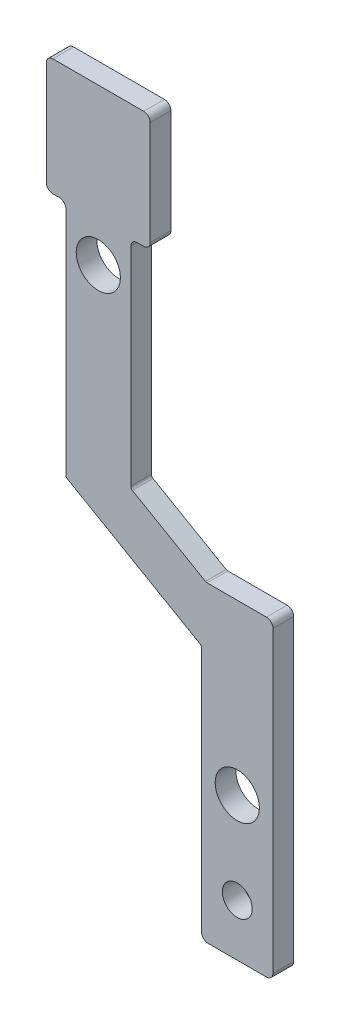
ISO-10303-21;
HEADER;
FILE_DESCRIPTION(('STEP AP214'),'2;1');
FILE_NAME('part.step','',(''),(''),'','','');
FILE_SCHEMA(('AUTOMOTIVE_DESIGN { 1 0 10303 214 1 1 1 1 }'));
ENDSEC;
DATA;
#1=APPLICATION_CONTEXT('core data for automotive mechanical design processes');
#2=APPLICATION_PROTOCOL_DEFINITION('international standard','automotive_design',2000,#1);
#3=PRODUCT_CONTEXT('',#1,'mechanical');
#4=PRODUCT('Part','Part','',(#3));
#5=PRODUCT_RELATED_PRODUCT_CATEGORY('part','',(#4));
#6=PRODUCT_DEFINITION_FORMATION('','',#4);
#7=PRODUCT_DEFINITION_CONTEXT('part definition',#1,'design');
#8=PRODUCT_DEFINITION('design','',#6,#7);
#9=PRODUCT_DEFINITION_SHAPE('','',#8);
#10=(LENGTH_UNIT() NAMED_UNIT(*) SI_UNIT(.MILLI.,.METRE.));
#11=(NAMED_UNIT(*) PLANE_ANGLE_UNIT() SI_UNIT($,.RADIAN.));
#12=(NAMED_UNIT(*) SI_UNIT($,.STERADIAN.) SOLID_ANGLE_UNIT());
#13=UNCERTAINTY_MEASURE_WITH_UNIT(LENGTH_MEASURE(1.E-05),#10,'distance_accuracy_value','');
#14=(GEOMETRIC_REPRESENTATION_CONTEXT(3) GLOBAL_UNCERTAINTY_ASSIGNED_CONTEXT((#13)) GLOBAL_UNIT_ASSIGNED_CONTEXT((#10,
#11,#12)) REPRESENTATION_CONTEXT('',''));
#15=CARTESIAN_POINT('',(0.,0.,0.));
#16=DIRECTION('',(0.,0.,1.));
#17=DIRECTION('',(1.,0.,0.));
#18=AXIS2_PLACEMENT_3D('',#15,#16,#17);
#19=CARTESIAN_POINT('',(8.00626999999999,44.50635,1.59144));
#20=DIRECTION('',(0.,0.,-1.));
#21=DIRECTION('',(-1.,0.,0.));
#22=AXIS2_PLACEMENT_3D('',#19,#20,#21);
#23=CYLINDRICAL_SURFACE('',#22,0.499999999999994);
#24=CARTESIAN_POINT('',(8.00626999999999,44.50635,0.));
#25=DIRECTION('',(0.,0.,1.));
#26=DIRECTION('',(-1.,0.,0.));
#27=AXIS2_PLACEMENT_3D('',#24,#25,#26);
#28=CIRCLE('',#27,0.499999999999994);
#29=CARTESIAN_POINT('',(8.00626999999999,44.00635,0.));
#30=VERTEX_POINT('',#29);
#31=CARTESIAN_POINT('',(8.50626999999998,44.50635,0.));
#32=VERTEX_POINT('',#31);
#33=EDGE_CURVE('E243',#30,#32,#28,.T.);
#34=ORIENTED_EDGE('',*,*,#33,.T.);
#35=DIRECTION('',(0.,0.,-1.));
#36=VECTOR('',#35,1.);
#37=CARTESIAN_POINT('',(8.50626999999998,44.50635,1.59144));
#38=LINE('',#37,#36);
#39=CARTESIAN_POINT('',(8.50626999999998,44.50635,1.59144));
#40=VERTEX_POINT('',#39);
#41=EDGE_CURVE('E11',#40,#32,#38,.T.);
#42=ORIENTED_EDGE('',*,*,#41,.F.);
#43=CARTESIAN_POINT('',(8.00626999999999,44.50635,1.59144));
#44=DIRECTION('',(0.,0.,1.));
#45=DIRECTION('',(-1.,0.,0.));
#46=AXIS2_PLACEMENT_3D('',#43,#44,#45);
#47=CIRCLE('',#46,0.499999999999994);
#48=CARTESIAN_POINT('',(8.00626999999999,44.00635,1.59144));
#49=VERTEX_POINT('',#48);
#50=EDGE_CURVE('E294',#49,#40,#47,.T.);
#51=ORIENTED_EDGE('',*,*,#50,.F.);
#52=DIRECTION('',(0.,0.,-1.));
#53=VECTOR('',#52,1.);
#54=CARTESIAN_POINT('',(8.00626999999999,44.00635,1.59144));
#55=LINE('',#54,#53);
#56=EDGE_CURVE('E239',#49,#30,#55,.T.);
#57=ORIENTED_EDGE('',*,*,#56,.T.);
#58=EDGE_LOOP('',(#34,#42,#51,#57));
#59=FACE_BOUND('',#58,.T.);
#60=ADVANCED_FACE('F39',(#59),#23,.T.);
#61=CARTESIAN_POINT('',(8.50626999999997,52.50635,1.59144));
#62=DIRECTION('',(-1.,0.,0.));
#63=DIRECTION('',(0.,-1.,0.));
#64=AXIS2_PLACEMENT_3D('',#61,#62,#63);
#65=PLANE('',#64);
#66=DIRECTION('',(0.,1.,0.));
#67=VECTOR('',#66,1.);
#68=CARTESIAN_POINT('',(8.50626999999997,52.50635,0.));
#69=LINE('',#68,#67);
#70=CARTESIAN_POINT('',(8.50626999999997,52.50635,0.));
#71=VERTEX_POINT('',#70);
#72=EDGE_CURVE('E246',#32,#71,#69,.T.);
#73=ORIENTED_EDGE('',*,*,#72,.T.);
#74=DIRECTION('',(0.,0.,-1.));
#75=VECTOR('',#74,1.);
#76=CARTESIAN_POINT('',(8.50626999999997,52.50635,1.59144));
#77=LINE('',#76,#75);
#78=CARTESIAN_POINT('',(8.50626999999997,52.50635,1.59144));
#79=VERTEX_POINT('',#78);
#80=EDGE_CURVE('E47',#79,#71,#77,.T.);
#81=ORIENTED_EDGE('',*,*,#80,.F.);
#82=DIRECTION('',(0.,1.,0.));
#83=VECTOR('',#82,1.);
#84=CARTESIAN_POINT('',(8.50626999999997,52.50635,1.59144));
#85=LINE('',#84,#83);
#86=EDGE_CURVE('E152',#40,#79,#85,.T.);
#87=ORIENTED_EDGE('',*,*,#86,.F.);
#88=ORIENTED_EDGE('',*,*,#41,.T.);
#89=EDGE_LOOP('',(#73,#81,#87,#88));
#90=FACE_BOUND('',#89,.T.);
#91=ADVANCED_FACE('F443',(#90),#65,.F.);
#92=CARTESIAN_POINT('',(8.00626999999996,52.50635,1.59144));
#93=DIRECTION('',(0.,0.,-1.));
#94=DIRECTION('',(-1.,0.,0.));
#95=AXIS2_PLACEMENT_3D('',#92,#93,#94);
#96=CYLINDRICAL_SURFACE('',#95,0.50000000000001);
#97=CARTESIAN_POINT('',(8.00626999999996,52.50635,0.));
#98=DIRECTION('',(0.,0.,1.));
#99=DIRECTION('',(-1.,0.,0.));
#100=AXIS2_PLACEMENT_3D('',#97,#98,#99);
#101=CIRCLE('',#100,0.50000000000001);
#102=CARTESIAN_POINT('',(8.00626999999996,53.00635,0.));
#103=VERTEX_POINT('',#102);
#104=EDGE_CURVE('E249',#71,#103,#101,.T.);
#105=ORIENTED_EDGE('',*,*,#104,.T.);
#106=DIRECTION('',(0.,0.,-1.));
#107=VECTOR('',#106,1.);
#108=CARTESIAN_POINT('',(8.00626999999996,53.00635,1.59144));
#109=LINE('',#108,#107);
#110=CARTESIAN_POINT('',(8.00626999999996,53.00635,1.59144));
#111=VERTEX_POINT('',#110);
#112=EDGE_CURVE('E355',#111,#103,#109,.T.);
#113=ORIENTED_EDGE('',*,*,#112,.F.);
#114=CARTESIAN_POINT('',(8.00626999999996,52.50635,1.59144));
#115=DIRECTION('',(0.,0.,1.));
#116=DIRECTION('',(-1.,0.,0.));
#117=AXIS2_PLACEMENT_3D('',#114,#115,#116);
#118=CIRCLE('',#117,0.50000000000001);
#119=EDGE_CURVE('E363',#79,#111,#118,.T.);
#120=ORIENTED_EDGE('',*,*,#119,.F.);
#121=ORIENTED_EDGE('',*,*,#80,.T.);
#122=EDGE_LOOP('',(#105,#113,#120,#121));
#123=FACE_BOUND('',#122,.T.);
#124=ADVANCED_FACE('F361',(#123),#96,.T.);
#125=CARTESIAN_POINT('',(1.00626999999998,53.00635,1.59144));
#126=DIRECTION('',(0.,-1.,0.));
#127=DIRECTION('',(0.,0.,-1.));
#128=AXIS2_PLACEMENT_3D('',#125,#126,#127);
#129=PLANE('',#128);
#130=DIRECTION('',(-1.,0.,0.));
#131=VECTOR('',#130,1.);
#132=CARTESIAN_POINT('',(1.00626999999998,53.00635,0.));
#133=LINE('',#132,#131);
#134=CARTESIAN_POINT('',(1.00626999999998,53.00635,0.));
#135=VERTEX_POINT('',#134);
#136=EDGE_CURVE('E251',#103,#135,#133,.T.);
#137=ORIENTED_EDGE('',*,*,#136,.T.);
#138=DIRECTION('',(0.,0.,-1.));
#139=VECTOR('',#138,1.);
#140=CARTESIAN_POINT('',(1.00626999999998,53.00635,1.59144));
#141=LINE('',#140,#139);
#142=CARTESIAN_POINT('',(1.00626999999998,53.00635,1.59144));
#143=VERTEX_POINT('',#142);
#144=EDGE_CURVE('E352',#143,#135,#141,.T.);
#145=ORIENTED_EDGE('',*,*,#144,.F.);
#146=DIRECTION('',(-1.,0.,0.));
#147=VECTOR('',#146,1.);
#148=CARTESIAN_POINT('',(1.00626999999998,53.00635,1.59144));
#149=LINE('',#148,#147);
#150=EDGE_CURVE('E381',#111,#143,#149,.T.);
#151=ORIENTED_EDGE('',*,*,#150,.F.);
#152=ORIENTED_EDGE('',*,*,#112,.T.);
#153=EDGE_LOOP('',(#137,#145,#151,#152));
#154=FACE_BOUND('',#153,.T.);
#155=ADVANCED_FACE('F372',(#154),#129,.F.);
#156=CARTESIAN_POINT('',(1.00626999999998,52.50635,1.59144));
#157=DIRECTION('',(0.,0.,-1.));
#158=DIRECTION('',(-1.,0.,0.));
#159=AXIS2_PLACEMENT_3D('',#156,#157,#158);
#160=CYLINDRICAL_SURFACE('',#159,0.500000000000007);
#161=CARTESIAN_POINT('',(1.00626999999998,52.50635,0.));
#162=DIRECTION('',(0.,0.,1.));
#163=DIRECTION('',(-1.,0.,0.));
#164=AXIS2_PLACEMENT_3D('',#161,#162,#163);
#165=CIRCLE('',#164,0.500000000000007);
#166=CARTESIAN_POINT('',(0.506269999999968,52.50635,0.));
#167=VERTEX_POINT('',#166);
#168=EDGE_CURVE('E253',#135,#167,#165,.T.);
#169=ORIENTED_EDGE('',*,*,#168,.T.);
#170=DIRECTION('',(0.,0.,-1.));
#171=VECTOR('',#170,1.);
#172=CARTESIAN_POINT('',(0.506269999999968,52.50635,1.59144));
#173=LINE('',#172,#171);
#174=CARTESIAN_POINT('',(0.506269999999968,52.50635,1.59144));
#175=VERTEX_POINT('',#174);
#176=EDGE_CURVE('E349',#175,#167,#173,.T.);
#177=ORIENTED_EDGE('',*,*,#176,.F.);
#178=CARTESIAN_POINT('',(1.00626999999998,52.50635,1.59144));
#179=DIRECTION('',(0.,0.,1.));
#180=DIRECTION('',(-1.,0.,0.));
#181=AXIS2_PLACEMENT_3D('',#178,#179,#180);
#182=CIRCLE('',#181,0.500000000000007);
#183=EDGE_CURVE('E378',#143,#175,#182,.T.);
#184=ORIENTED_EDGE('',*,*,#183,.F.);
#185=ORIENTED_EDGE('',*,*,#144,.T.);
#186=EDGE_LOOP('',(#169,#177,#184,#185));
#187=FACE_BOUND('',#186,.T.);
#188=ADVANCED_FACE('F376',(#187),#160,.T.);
#189=CARTESIAN_POINT('',(0.506269999999971,44.50635,1.59144));
#190=DIRECTION('',(1.,0.,0.));
#191=DIRECTION('',(0.,1.,0.));
#192=AXIS2_PLACEMENT_3D('',#189,#190,#191);
#193=PLANE('',#192);
#194=DIRECTION('',(0.,-1.,0.));
#195=VECTOR('',#194,1.);
#196=CARTESIAN_POINT('',(0.506269999999971,44.50635,0.));
#197=LINE('',#196,#195);
#198=CARTESIAN_POINT('',(0.506269999999979,44.50635,0.));
#199=VERTEX_POINT('',#198);
#200=EDGE_CURVE('E255',#167,#199,#197,.T.);
#201=ORIENTED_EDGE('',*,*,#200,.T.);
#202=DIRECTION('',(0.,0.,-1.));
#203=VECTOR('',#202,1.);
#204=CARTESIAN_POINT('',(0.506269999999979,44.50635,1.59144));
#205=LINE('',#204,#203);
#206=CARTESIAN_POINT('',(0.506269999999979,44.50635,1.59144));
#207=VERTEX_POINT('',#206);
#208=EDGE_CURVE('E346',#207,#199,#205,.T.);
#209=ORIENTED_EDGE('',*,*,#208,.F.);
#210=DIRECTION('',(0.,-1.,0.));
#211=VECTOR('',#210,1.);
#212=CARTESIAN_POINT('',(0.506269999999971,44.50635,1.59144));
#213=LINE('',#212,#211);
#214=EDGE_CURVE('E380',#175,#207,#213,.T.);
#215=ORIENTED_EDGE('',*,*,#214,.F.);
#216=ORIENTED_EDGE('',*,*,#176,.T.);
#217=EDGE_LOOP('',(#201,#209,#215,#216));
#218=FACE_BOUND('',#217,.T.);
#219=ADVANCED_FACE('F456',(#218),#193,.F.);
#220=CARTESIAN_POINT('',(1.00626999999999,44.50635,1.59144));
#221=DIRECTION('',(0.,0.,-1.));
#222=DIRECTION('',(-1.,0.,0.));
#223=AXIS2_PLACEMENT_3D('',#220,#221,#222);
#224=CYLINDRICAL_SURFACE('',#223,0.500000000000009);
#225=CARTESIAN_POINT('',(1.00626999999999,44.50635,0.));
#226=DIRECTION('',(0.,0.,1.));
#227=DIRECTION('',(-1.,0.,0.));
#228=AXIS2_PLACEMENT_3D('',#225,#226,#227);
#229=CIRCLE('',#228,0.500000000000009);
#230=CARTESIAN_POINT('',(1.00626999999999,44.00635,0.));
#231=VERTEX_POINT('',#230);
#232=EDGE_CURVE('E257',#199,#231,#229,.T.);
#233=ORIENTED_EDGE('',*,*,#232,.T.);
#234=DIRECTION('',(0.,0.,-1.));
#235=VECTOR('',#234,1.);
#236=CARTESIAN_POINT('',(1.00626999999999,44.00635,1.59144));
#237=LINE('',#236,#235);
#238=CARTESIAN_POINT('',(1.00626999999999,44.00635,1.59144));
#239=VERTEX_POINT('',#238);
#240=EDGE_CURVE('E343',#239,#231,#237,.T.);
#241=ORIENTED_EDGE('',*,*,#240,.F.);
#242=CARTESIAN_POINT('',(1.00626999999999,44.50635,1.59144));
#243=DIRECTION('',(0.,0.,1.));
#244=DIRECTION('',(-1.,0.,0.));
#245=AXIS2_PLACEMENT_3D('',#242,#243,#244);
#246=CIRCLE('',#245,0.500000000000009);
#247=EDGE_CURVE('E383',#207,#239,#246,.T.);
#248=ORIENTED_EDGE('',*,*,#247,.F.);
#249=ORIENTED_EDGE('',*,*,#208,.T.);
#250=EDGE_LOOP('',(#233,#241,#248,#249));
#251=FACE_BOUND('',#250,.T.);
#252=ADVANCED_FACE('F459',(#251),#224,.T.);
#253=CARTESIAN_POINT('',(1.50626999999999,44.00635,1.59144));
#254=DIRECTION('',(0.,1.,0.));
#255=DIRECTION('',(0.,0.,1.));
#256=AXIS2_PLACEMENT_3D('',#253,#254,#255);
#257=PLANE('',#256);
#258=DIRECTION('',(1.,0.,0.));
#259=VECTOR('',#258,1.);
#260=CARTESIAN_POINT('',(1.50626999999999,44.00635,0.));
#261=LINE('',#260,#259);
#262=CARTESIAN_POINT('',(1.50626999999999,44.00635,0.));
#263=VERTEX_POINT('',#262);
#264=EDGE_CURVE('E259',#231,#263,#261,.T.);
#265=ORIENTED_EDGE('',*,*,#264,.T.);
#266=DIRECTION('',(0.,0.,-1.));
#267=VECTOR('',#266,1.);
#268=CARTESIAN_POINT('',(1.50626999999999,44.00635,1.59144));
#269=LINE('',#268,#267);
#270=CARTESIAN_POINT('',(1.50626999999999,44.00635,1.59144));
#271=VERTEX_POINT('',#270);
#272=EDGE_CURVE('E340',#271,#263,#269,.T.);
#273=ORIENTED_EDGE('',*,*,#272,.F.);
#274=DIRECTION('',(1.,0.,0.));
#275=VECTOR('',#274,1.);
#276=CARTESIAN_POINT('',(1.50626999999999,44.00635,1.59144));
#277=LINE('',#276,#275);
#278=EDGE_CURVE('E389',#239,#271,#277,.T.);
#279=ORIENTED_EDGE('',*,*,#278,.F.);
#280=ORIENTED_EDGE('',*,*,#240,.T.);
#281=EDGE_LOOP('',(#265,#273,#279,#280));
#282=FACE_BOUND('',#281,.T.);
#283=ADVANCED_FACE('F463',(#282),#257,.F.);
#284=CARTESIAN_POINT('',(1.50626999999999,43.50635,1.59144));
#285=DIRECTION('',(0.,0.,-1.));
#286=DIRECTION('',(-1.,0.,0.));
#287=AXIS2_PLACEMENT_3D('',#284,#285,#286);
#288=CYLINDRICAL_SURFACE('',#287,0.49999999999999);
#289=CARTESIAN_POINT('',(1.50626999999999,43.50635,0.));
#290=DIRECTION('',(0.,0.,-1.));
#291=DIRECTION('',(1.,0.,0.));
#292=AXIS2_PLACEMENT_3D('',#289,#290,#291);
#293=CIRCLE('',#292,0.49999999999999);
#294=CARTESIAN_POINT('',(2.00626999999997,43.50635,0.));
#295=VERTEX_POINT('',#294);
#296=EDGE_CURVE('E261',#263,#295,#293,.T.);
#297=ORIENTED_EDGE('',*,*,#296,.T.);
#298=DIRECTION('',(0.,0.,-1.));
#299=VECTOR('',#298,1.);
#300=CARTESIAN_POINT('',(2.00626999999997,43.50635,1.59144));
#301=LINE('',#300,#299);
#302=CARTESIAN_POINT('',(2.00626999999997,43.50635,1.59144));
#303=VERTEX_POINT('',#302);
#304=EDGE_CURVE('E337',#303,#295,#301,.T.);
#305=ORIENTED_EDGE('',*,*,#304,.F.);
#306=CARTESIAN_POINT('',(1.50626999999999,43.50635,1.59144));
#307=DIRECTION('',(0.,0.,-1.));
#308=DIRECTION('',(1.,0.,0.));
#309=AXIS2_PLACEMENT_3D('',#306,#307,#308);
#310=CIRCLE('',#309,0.49999999999999);
#311=EDGE_CURVE('E391',#271,#303,#310,.T.);
#312=ORIENTED_EDGE('',*,*,#311,.F.);
#313=ORIENTED_EDGE('',*,*,#272,.T.);
#314=EDGE_LOOP('',(#297,#305,#312,#313));
#315=FACE_BOUND('',#314,.T.);
#316=ADVANCED_FACE('F467',(#315),#288,.F.);
#317=CARTESIAN_POINT('',(2.00626999999998,25.7742991924311,1.59144));
#318=DIRECTION('',(1.,0.,0.));
#319=DIRECTION('',(0.,1.,0.));
#320=AXIS2_PLACEMENT_3D('',#317,#318,#319);
#321=PLANE('',#320);
#322=DIRECTION('',(0.,-1.,0.));
#323=VECTOR('',#322,1.);
#324=CARTESIAN_POINT('',(2.00626999999998,25.7742991924311,0.));
#325=LINE('',#324,#323);
#326=CARTESIAN_POINT('',(2.00626999999999,25.7742991924311,0.));
#327=VERTEX_POINT('',#326);
#328=EDGE_CURVE('E263',#295,#327,#325,.T.);
#329=ORIENTED_EDGE('',*,*,#328,.T.);
#330=DIRECTION('',(0.,0.,-1.));
#331=VECTOR('',#330,1.);
#332=CARTESIAN_POINT('',(2.00626999999999,25.7742991924311,1.59144));
#333=LINE('',#332,#331);
#334=CARTESIAN_POINT('',(2.00626999999999,25.7742991924311,1.59144));
#335=VERTEX_POINT('',#334);
#336=EDGE_CURVE('E334',#335,#327,#333,.T.);
#337=ORIENTED_EDGE('',*,*,#336,.F.);
#338=DIRECTION('',(0.,-1.,0.));
#339=VECTOR('',#338,1.);
#340=CARTESIAN_POINT('',(2.00626999999998,25.7742991924311,1.59144));
#341=LINE('',#340,#339);
#342=EDGE_CURVE('E393',#303,#335,#341,.T.);
#343=ORIENTED_EDGE('',*,*,#342,.F.);
#344=ORIENTED_EDGE('',*,*,#304,.T.);
#345=EDGE_LOOP('',(#329,#337,#343,#344));
#346=FACE_BOUND('',#345,.T.);
#347=ADVANCED_FACE('F471',(#346),#321,.F.);
#348=CARTESIAN_POINT('',(2.25626999999998,25.7742991924311,1.59144));
#349=DIRECTION('',(0.,0.,-1.));
#350=DIRECTION('',(-1.,0.,0.));
#351=AXIS2_PLACEMENT_3D('',#348,#349,#350);
#352=CYLINDRICAL_SURFACE('',#351,0.249999999999999);
#353=CARTESIAN_POINT('',(2.25626999999998,25.7742991924311,0.));
#354=DIRECTION('',(0.,0.,1.));
#355=DIRECTION('',(-1.,0.,0.));
#356=AXIS2_PLACEMENT_3D('',#353,#354,#355);
#357=CIRCLE('',#356,0.249999999999999);
#358=CARTESIAN_POINT('',(2.13126999999998,25.557792841485,0.));
#359=VERTEX_POINT('',#358);
#360=EDGE_CURVE('E265',#327,#359,#357,.T.);
#361=ORIENTED_EDGE('',*,*,#360,.T.);
#362=DIRECTION('',(0.,0.,-1.));
#363=VECTOR('',#362,1.);
#364=CARTESIAN_POINT('',(2.13126999999998,25.557792841485,1.59144));
#365=LINE('',#364,#363);
#366=CARTESIAN_POINT('',(2.13126999999998,25.557792841485,1.59144));
#367=VERTEX_POINT('',#366);
#368=EDGE_CURVE('E331',#367,#359,#365,.T.);
#369=ORIENTED_EDGE('',*,*,#368,.F.);
#370=CARTESIAN_POINT('',(2.25626999999998,25.7742991924311,1.59144));
#371=DIRECTION('',(0.,0.,1.));
#372=DIRECTION('',(-1.,0.,0.));
#373=AXIS2_PLACEMENT_3D('',#370,#371,#372);
#374=CIRCLE('',#373,0.249999999999999);
#375=EDGE_CURVE('E395',#335,#367,#374,.T.);
#376=ORIENTED_EDGE('',*,*,#375,.F.);
#377=ORIENTED_EDGE('',*,*,#336,.T.);
#378=EDGE_LOOP('',(#361,#369,#376,#377));
#379=FACE_BOUND('',#378,.T.);
#380=ADVANCED_FACE('F475',(#379),#352,.T.);
#381=CARTESIAN_POINT('',(12.33127,19.6688200957508,1.59144));
#382=DIRECTION('',(0.500000000000001,0.866025403784438,0.));
#383=DIRECTION('',(-0.866025403784438,0.500000000000001,0.));
#384=AXIS2_PLACEMENT_3D('',#381,#382,#383);
#385=PLANE('',#384);
#386=DIRECTION('',(0.866025403784438,-0.5,0.));
#387=VECTOR('',#386,1.);
#388=CARTESIAN_POINT('',(12.33127,19.6688200957508,0.));
#389=LINE('',#388,#387);
#390=CARTESIAN_POINT('',(12.33127,19.6688200957508,0.));
#391=VERTEX_POINT('',#390);
#392=EDGE_CURVE('E267',#359,#391,#389,.T.);
#393=ORIENTED_EDGE('',*,*,#392,.T.);
#394=DIRECTION('',(0.,0.,-1.));
#395=VECTOR('',#394,1.);
#396=CARTESIAN_POINT('',(12.33127,19.6688200957508,1.59144));
#397=LINE('',#396,#395);
#398=CARTESIAN_POINT('',(12.33127,19.6688200957508,1.59144));
#399=VERTEX_POINT('',#398);
#400=EDGE_CURVE('E328',#399,#391,#397,.T.);
#401=ORIENTED_EDGE('',*,*,#400,.F.);
#402=DIRECTION('',(0.866025403784438,-0.5,0.));
#403=VECTOR('',#402,1.);
#404=CARTESIAN_POINT('',(12.33127,19.6688200957508,1.59144));
#405=LINE('',#404,#403);
#406=EDGE_CURVE('E397',#367,#399,#405,.T.);
#407=ORIENTED_EDGE('',*,*,#406,.F.);
#408=ORIENTED_EDGE('',*,*,#368,.T.);
#409=EDGE_LOOP('',(#393,#401,#407,#408));
#410=FACE_BOUND('',#409,.T.);
#411=ADVANCED_FACE('F479',(#410),#385,.F.);
#412=CARTESIAN_POINT('',(12.20627,19.4523137448047,1.59144));
#413=DIRECTION('',(0.,0.,-1.));
#414=DIRECTION('',(-1.,0.,0.));
#415=AXIS2_PLACEMENT_3D('',#412,#413,#414);
#416=CYLINDRICAL_SURFACE('',#415,0.250000000000001);
#417=CARTESIAN_POINT('',(12.20627,19.4523137448047,0.));
#418=DIRECTION('',(0.,0.,-1.));
#419=DIRECTION('',(1.,0.,0.));
#420=AXIS2_PLACEMENT_3D('',#417,#418,#419);
#421=CIRCLE('',#420,0.250000000000001);
#422=CARTESIAN_POINT('',(12.45627,19.4523137448047,0.));
#423=VERTEX_POINT('',#422);
#424=EDGE_CURVE('E269',#391,#423,#421,.T.);
#425=ORIENTED_EDGE('',*,*,#424,.T.);
#426=DIRECTION('',(0.,0.,-1.));
#427=VECTOR('',#426,1.);
#428=CARTESIAN_POINT('',(12.45627,19.4523137448047,1.59144));
#429=LINE('',#428,#427);
#430=CARTESIAN_POINT('',(12.45627,19.4523137448047,1.59144));
#431=VERTEX_POINT('',#430);
#432=EDGE_CURVE('E325',#431,#423,#429,.T.);
#433=ORIENTED_EDGE('',*,*,#432,.F.);
#434=CARTESIAN_POINT('',(12.20627,19.4523137448047,1.59144));
#435=DIRECTION('',(0.,0.,-1.));
#436=DIRECTION('',(1.,0.,0.));
#437=AXIS2_PLACEMENT_3D('',#434,#435,#436);
#438=CIRCLE('',#437,0.250000000000001);
#439=EDGE_CURVE('E399',#399,#431,#438,.T.);
#440=ORIENTED_EDGE('',*,*,#439,.F.);
#441=ORIENTED_EDGE('',*,*,#400,.T.);
#442=EDGE_LOOP('',(#425,#433,#440,#441));
#443=FACE_BOUND('',#442,.T.);
#444=ADVANCED_FACE('F483',(#443),#416,.F.);
#445=CARTESIAN_POINT('',(12.45627,0.506350000000004,1.59144));
#446=DIRECTION('',(1.,0.,0.));
#447=DIRECTION('',(0.,1.,0.));
#448=AXIS2_PLACEMENT_3D('',#445,#446,#447);
#449=PLANE('',#448);
#450=DIRECTION('',(0.,-1.,0.));
#451=VECTOR('',#450,1.);
#452=CARTESIAN_POINT('',(12.45627,0.506350000000004,0.));
#453=LINE('',#452,#451);
#454=CARTESIAN_POINT('',(12.45627,0.506350000000004,0.));
#455=VERTEX_POINT('',#454);
#456=EDGE_CURVE('E271',#423,#455,#453,.T.);
#457=ORIENTED_EDGE('',*,*,#456,.T.);
#458=DIRECTION('',(0.,0.,-1.));
#459=VECTOR('',#458,1.);
#460=CARTESIAN_POINT('',(12.45627,0.506350000000004,1.59144));
#461=LINE('',#460,#459);
#462=CARTESIAN_POINT('',(12.45627,0.506350000000004,1.59144));
#463=VERTEX_POINT('',#462);
#464=EDGE_CURVE('E322',#463,#455,#461,.T.);
#465=ORIENTED_EDGE('',*,*,#464,.F.);
#466=DIRECTION('',(0.,-1.,0.));
#467=VECTOR('',#466,1.);
#468=CARTESIAN_POINT('',(12.45627,0.506350000000004,1.59144));
#469=LINE('',#468,#467);
#470=EDGE_CURVE('E401',#431,#463,#469,.T.);
#471=ORIENTED_EDGE('',*,*,#470,.F.);
#472=ORIENTED_EDGE('',*,*,#432,.T.);
#473=EDGE_LOOP('',(#457,#465,#471,#472));
#474=FACE_BOUND('',#473,.T.);
#475=ADVANCED_FACE('F487',(#474),#449,.F.);
#476=CARTESIAN_POINT('',(12.95627,0.506350000000004,1.59144));
#477=DIRECTION('',(0.,0.,-1.));
#478=DIRECTION('',(-1.,0.,0.));
#479=AXIS2_PLACEMENT_3D('',#476,#477,#478);
#480=CYLINDRICAL_SURFACE('',#479,0.499999999999999);
#481=CARTESIAN_POINT('',(12.95627,0.506350000000004,0.));
#482=DIRECTION('',(0.,0.,1.));
#483=DIRECTION('',(-1.,0.,0.));
#484=AXIS2_PLACEMENT_3D('',#481,#482,#483);
#485=CIRCLE('',#484,0.499999999999999);
#486=CARTESIAN_POINT('',(12.95627,0.00635000000000476,0.));
#487=VERTEX_POINT('',#486);
#488=EDGE_CURVE('E273',#455,#487,#485,.T.);
#489=ORIENTED_EDGE('',*,*,#488,.T.);
#490=DIRECTION('',(0.,0.,-1.));
#491=VECTOR('',#490,1.);
#492=CARTESIAN_POINT('',(12.95627,0.00635000000000476,1.59144));
#493=LINE('',#492,#491);
#494=CARTESIAN_POINT('',(12.95627,0.00635000000000476,1.59144));
#495=VERTEX_POINT('',#494);
#496=EDGE_CURVE('E319',#495,#487,#493,.T.);
#497=ORIENTED_EDGE('',*,*,#496,.F.);
#498=CARTESIAN_POINT('',(12.95627,0.506350000000004,1.59144));
#499=DIRECTION('',(0.,0.,1.));
#500=DIRECTION('',(-1.,0.,0.));
#501=AXIS2_PLACEMENT_3D('',#498,#499,#500);
#502=CIRCLE('',#501,0.499999999999999);
#503=EDGE_CURVE('E403',#463,#495,#502,.T.);
#504=ORIENTED_EDGE('',*,*,#503,.F.);
#505=ORIENTED_EDGE('',*,*,#464,.T.);
#506=EDGE_LOOP('',(#489,#497,#504,#505));
#507=FACE_BOUND('',#506,.T.);
#508=ADVANCED_FACE('F491',(#507),#480,.T.);
#509=CARTESIAN_POINT('',(17.45627,0.00635000000000641,1.59144));
#510=DIRECTION('',(0.,1.,0.));
#511=DIRECTION('',(-1.,0.,0.));
#512=AXIS2_PLACEMENT_3D('',#509,#510,#511);
#513=PLANE('',#512);
#514=DIRECTION('',(1.,0.,0.));
#515=VECTOR('',#514,1.);
#516=CARTESIAN_POINT('',(17.45627,0.00635000000000641,0.));
#517=LINE('',#516,#515);
#518=CARTESIAN_POINT('',(17.45627,0.00635000000000577,0.));
#519=VERTEX_POINT('',#518);
#520=EDGE_CURVE('E275',#487,#519,#517,.T.);
#521=ORIENTED_EDGE('',*,*,#520,.T.);
#522=DIRECTION('',(0.,0.,-1.));
#523=VECTOR('',#522,1.);
#524=CARTESIAN_POINT('',(17.45627,0.00635000000000577,1.59144));
#525=LINE('',#524,#523);
#526=CARTESIAN_POINT('',(17.45627,0.00635000000000577,1.59144));
#527=VERTEX_POINT('',#526);
#528=EDGE_CURVE('E316',#527,#519,#525,.T.);
#529=ORIENTED_EDGE('',*,*,#528,.F.);
#530=DIRECTION('',(1.,0.,0.));
#531=VECTOR('',#530,1.);
#532=CARTESIAN_POINT('',(17.45627,0.00635000000000641,1.59144));
#533=LINE('',#532,#531);
#534=EDGE_CURVE('E405',#495,#527,#533,.T.);
#535=ORIENTED_EDGE('',*,*,#534,.F.);
#536=ORIENTED_EDGE('',*,*,#496,.T.);
#537=EDGE_LOOP('',(#521,#529,#535,#536));
#538=FACE_BOUND('',#537,.T.);
#539=ADVANCED_FACE('F495',(#538),#513,.F.);
#540=CARTESIAN_POINT('',(17.45627,0.506350000000006,1.59144));
#541=DIRECTION('',(0.,0.,-1.));
#542=DIRECTION('',(-1.,0.,0.));
#543=AXIS2_PLACEMENT_3D('',#540,#541,#542);
#544=CYLINDRICAL_SURFACE('',#543,0.5);
#545=CARTESIAN_POINT('',(17.45627,0.506350000000006,0.));
#546=DIRECTION('',(0.,0.,1.));
#547=DIRECTION('',(-1.,0.,0.));
#548=AXIS2_PLACEMENT_3D('',#545,#546,#547);
#549=CIRCLE('',#548,0.5);
#550=CARTESIAN_POINT('',(17.95627,0.506350000000006,0.));
#551=VERTEX_POINT('',#550);
#552=EDGE_CURVE('E277',#519,#551,#549,.T.);
#553=ORIENTED_EDGE('',*,*,#552,.T.);
#554=DIRECTION('',(0.,0.,-1.));
#555=VECTOR('',#554,1.);
#556=CARTESIAN_POINT('',(17.95627,0.506350000000006,1.59144));
#557=LINE('',#556,#555);
#558=CARTESIAN_POINT('',(17.95627,0.506350000000006,1.59144));
#559=VERTEX_POINT('',#558);
#560=EDGE_CURVE('E313',#559,#551,#557,.T.);
#561=ORIENTED_EDGE('',*,*,#560,.F.);
#562=CARTESIAN_POINT('',(17.45627,0.506350000000006,1.59144));
#563=DIRECTION('',(0.,0.,1.));
#564=DIRECTION('',(-1.,0.,0.));
#565=AXIS2_PLACEMENT_3D('',#562,#563,#564);
#566=CIRCLE('',#565,0.5);
#567=EDGE_CURVE('E407',#527,#559,#566,.T.);
#568=ORIENTED_EDGE('',*,*,#567,.F.);
#569=ORIENTED_EDGE('',*,*,#528,.T.);
#570=EDGE_LOOP('',(#553,#561,#568,#569));
#571=FACE_BOUND('',#570,.T.);
#572=ADVANCED_FACE('F499',(#571),#544,.T.);
#573=CARTESIAN_POINT('',(17.95627,23.50635,1.59144));
#574=DIRECTION('',(-1.,0.,0.));
#575=DIRECTION('',(0.,-1.,0.));
#576=AXIS2_PLACEMENT_3D('',#573,#574,#575);
#577=PLANE('',#576);
#578=DIRECTION('',(0.,1.,0.));
#579=VECTOR('',#578,1.);
#580=CARTESIAN_POINT('',(17.95627,23.50635,0.));
#581=LINE('',#580,#579);
#582=CARTESIAN_POINT('',(17.95627,23.50635,0.));
#583=VERTEX_POINT('',#582);
#584=EDGE_CURVE('E279',#551,#583,#581,.T.);
#585=ORIENTED_EDGE('',*,*,#584,.T.);
#586=DIRECTION('',(0.,0.,-1.));
#587=VECTOR('',#586,1.);
#588=CARTESIAN_POINT('',(17.95627,23.50635,1.59144));
#589=LINE('',#588,#587);
#590=CARTESIAN_POINT('',(17.95627,23.50635,1.59144));
#591=VERTEX_POINT('',#590);
#592=EDGE_CURVE('E310',#591,#583,#589,.T.);
#593=ORIENTED_EDGE('',*,*,#592,.F.);
#594=DIRECTION('',(0.,1.,0.));
#595=VECTOR('',#594,1.);
#596=CARTESIAN_POINT('',(17.95627,23.50635,1.59144));
#597=LINE('',#596,#595);
#598=EDGE_CURVE('E409',#559,#591,#597,.T.);
#599=ORIENTED_EDGE('',*,*,#598,.F.);
#600=ORIENTED_EDGE('',*,*,#560,.T.);
#601=EDGE_LOOP('',(#585,#593,#599,#600));
#602=FACE_BOUND('',#601,.T.);
#603=ADVANCED_FACE('F503',(#602),#577,.F.);
#604=CARTESIAN_POINT('',(17.45627,23.50635,1.59144));
#605=DIRECTION('',(0.,0.,-1.));
#606=DIRECTION('',(-1.,0.,0.));
#607=AXIS2_PLACEMENT_3D('',#604,#605,#606);
#608=CYLINDRICAL_SURFACE('',#607,0.5);
#609=CARTESIAN_POINT('',(17.45627,23.50635,0.));
#610=DIRECTION('',(0.,0.,1.));
#611=DIRECTION('',(-1.,0.,0.));
#612=AXIS2_PLACEMENT_3D('',#609,#610,#611);
#613=CIRCLE('',#612,0.5);
#614=CARTESIAN_POINT('',(17.45627,24.00635,0.));
#615=VERTEX_POINT('',#614);
#616=EDGE_CURVE('E281',#583,#615,#613,.T.);
#617=ORIENTED_EDGE('',*,*,#616,.T.);
#618=DIRECTION('',(0.,0.,-1.));
#619=VECTOR('',#618,1.);
#620=CARTESIAN_POINT('',(17.45627,24.00635,1.59144));
#621=LINE('',#620,#619);
#622=CARTESIAN_POINT('',(17.45627,24.00635,1.59144));
#623=VERTEX_POINT('',#622);
#624=EDGE_CURVE('E307',#623,#615,#621,.T.);
#625=ORIENTED_EDGE('',*,*,#624,.F.);
#626=CARTESIAN_POINT('',(17.45627,23.50635,1.59144));
#627=DIRECTION('',(0.,0.,1.));
#628=DIRECTION('',(-1.,0.,0.));
#629=AXIS2_PLACEMENT_3D('',#626,#627,#628);
#630=CIRCLE('',#629,0.5);
#631=EDGE_CURVE('E411',#591,#623,#630,.T.);
#632=ORIENTED_EDGE('',*,*,#631,.F.);
#633=ORIENTED_EDGE('',*,*,#592,.T.);
#634=EDGE_LOOP('',(#617,#625,#632,#633));
#635=FACE_BOUND('',#634,.T.);
#636=ADVANCED_FACE('F507',(#635),#608,.T.);
#637=CARTESIAN_POINT('',(12.8854351245988,24.00635,1.59144));
#638=DIRECTION('',(0.,-1.,0.));
#639=DIRECTION('',(0.,0.,-1.));
#640=AXIS2_PLACEMENT_3D('',#637,#638,#639);
#641=PLANE('',#640);
#642=DIRECTION('',(-1.,0.,0.));
#643=VECTOR('',#642,1.);
#644=CARTESIAN_POINT('',(12.8854351245988,24.00635,0.));
#645=LINE('',#644,#643);
#646=CARTESIAN_POINT('',(12.8854351245988,24.00635,0.));
#647=VERTEX_POINT('',#646);
#648=EDGE_CURVE('E283',#615,#647,#645,.T.);
#649=ORIENTED_EDGE('',*,*,#648,.T.);
#650=DIRECTION('',(0.,0.,-1.));
#651=VECTOR('',#650,1.);
#652=CARTESIAN_POINT('',(12.8854351245988,24.00635,1.59144));
#653=LINE('',#652,#651);
#654=CARTESIAN_POINT('',(12.8854351245988,24.00635,1.59144));
#655=VERTEX_POINT('',#654);
#656=EDGE_CURVE('E304',#655,#647,#653,.T.);
#657=ORIENTED_EDGE('',*,*,#656,.F.);
#658=DIRECTION('',(-1.,0.,0.));
#659=VECTOR('',#658,1.);
#660=CARTESIAN_POINT('',(12.8854351245988,24.00635,1.59144));
#661=LINE('',#660,#659);
#662=EDGE_CURVE('E413',#623,#655,#661,.T.);
#663=ORIENTED_EDGE('',*,*,#662,.F.);
#664=ORIENTED_EDGE('',*,*,#624,.T.);
#665=EDGE_LOOP('',(#649,#657,#663,#664));
#666=FACE_BOUND('',#665,.T.);
#667=ADVANCED_FACE('F511',(#666),#641,.F.);
#668=CARTESIAN_POINT('',(12.8854351245988,24.25635,1.59144));
#669=DIRECTION('',(0.,0.,-1.));
#670=DIRECTION('',(-1.,0.,0.));
#671=AXIS2_PLACEMENT_3D('',#668,#669,#670);
#672=CYLINDRICAL_SURFACE('',#671,0.250000000000001);
#673=CARTESIAN_POINT('',(12.8854351245988,24.25635,0.));
#674=DIRECTION('',(0.,0.,-1.));
#675=DIRECTION('',(1.,0.,0.));
#676=AXIS2_PLACEMENT_3D('',#673,#674,#675);
#677=CIRCLE('',#676,0.250000000000001);
#678=CARTESIAN_POINT('',(12.7604351245988,24.0398436490539,0.));
#679=VERTEX_POINT('',#678);
#680=EDGE_CURVE('E285',#647,#679,#677,.T.);
#681=ORIENTED_EDGE('',*,*,#680,.T.);
#682=DIRECTION('',(0.,0.,-1.));
#683=VECTOR('',#682,1.);
#684=CARTESIAN_POINT('',(12.7604351245988,24.0398436490539,1.59144));
#685=LINE('',#684,#683);
#686=CARTESIAN_POINT('',(12.7604351245988,24.0398436490539,1.59144));
#687=VERTEX_POINT('',#686);
#688=EDGE_CURVE('E301',#687,#679,#685,.T.);
#689=ORIENTED_EDGE('',*,*,#688,.F.);
#690=CARTESIAN_POINT('',(12.8854351245988,24.25635,1.59144));
#691=DIRECTION('',(0.,0.,-1.));
#692=DIRECTION('',(1.,0.,0.));
#693=AXIS2_PLACEMENT_3D('',#690,#691,#692);
#694=CIRCLE('',#693,0.250000000000001);
#695=EDGE_CURVE('E415',#655,#687,#694,.T.);
#696=ORIENTED_EDGE('',*,*,#695,.F.);
#697=ORIENTED_EDGE('',*,*,#656,.T.);
#698=EDGE_LOOP('',(#681,#689,#696,#697));
#699=FACE_BOUND('',#698,.T.);
#700=ADVANCED_FACE('F515',(#699),#672,.F.);
#701=CARTESIAN_POINT('',(7.13126999999998,27.2898436490539,1.59144));
#702=DIRECTION('',(-0.5,-0.866025403784439,0.));
#703=DIRECTION('',(0.866025403784439,-0.5,0.));
#704=AXIS2_PLACEMENT_3D('',#701,#702,#703);
#705=PLANE('',#704);
#706=DIRECTION('',(-0.866025403784438,0.5,0.));
#707=VECTOR('',#706,1.);
#708=CARTESIAN_POINT('',(7.13126999999998,27.2898436490539,0.));
#709=LINE('',#708,#707);
#710=CARTESIAN_POINT('',(7.13126999999998,27.2898436490539,0.));
#711=VERTEX_POINT('',#710);
#712=EDGE_CURVE('E287',#679,#711,#709,.T.);
#713=ORIENTED_EDGE('',*,*,#712,.T.);
#714=DIRECTION('',(0.,0.,-1.));
#715=VECTOR('',#714,1.);
#716=CARTESIAN_POINT('',(7.13126999999998,27.2898436490539,1.59144));
#717=LINE('',#716,#715);
#718=CARTESIAN_POINT('',(7.13126999999998,27.2898436490539,1.59144));
#719=VERTEX_POINT('',#718);
#720=EDGE_CURVE('E298',#719,#711,#717,.T.);
#721=ORIENTED_EDGE('',*,*,#720,.F.);
#722=DIRECTION('',(-0.866025403784438,0.5,0.));
#723=VECTOR('',#722,1.);
#724=CARTESIAN_POINT('',(7.13126999999998,27.2898436490539,1.59144));
#725=LINE('',#724,#723);
#726=EDGE_CURVE('E417',#687,#719,#725,.T.);
#727=ORIENTED_EDGE('',*,*,#726,.F.);
#728=ORIENTED_EDGE('',*,*,#688,.T.);
#729=EDGE_LOOP('',(#713,#721,#727,#728));
#730=FACE_BOUND('',#729,.T.);
#731=ADVANCED_FACE('F423',(#730),#705,.F.);
#732=CARTESIAN_POINT('',(7.25626999999998,27.50635,1.59144));
#733=DIRECTION('',(0.,0.,-1.));
#734=DIRECTION('',(-1.,0.,0.));
#735=AXIS2_PLACEMENT_3D('',#732,#733,#734);
#736=CYLINDRICAL_SURFACE('',#735,0.250000000000001);
#737=CARTESIAN_POINT('',(7.25626999999998,27.50635,0.));
#738=DIRECTION('',(0.,0.,-1.));
#739=DIRECTION('',(1.,0.,0.));
#740=AXIS2_PLACEMENT_3D('',#737,#738,#739);
#741=CIRCLE('',#740,0.250000000000001);
#742=CARTESIAN_POINT('',(7.00626999999998,27.50635,0.));
#743=VERTEX_POINT('',#742);
#744=EDGE_CURVE('E289',#711,#743,#741,.T.);
#745=ORIENTED_EDGE('',*,*,#744,.T.);
#746=DIRECTION('',(0.,0.,-1.));
#747=VECTOR('',#746,1.);
#748=CARTESIAN_POINT('',(7.00626999999998,27.50635,1.59144));
#749=LINE('',#748,#747);
#750=CARTESIAN_POINT('',(7.00626999999998,27.50635,1.59144));
#751=VERTEX_POINT('',#750);
#752=EDGE_CURVE('E234',#751,#743,#749,.T.);
#753=ORIENTED_EDGE('',*,*,#752,.F.);
#754=CARTESIAN_POINT('',(7.25626999999998,27.50635,1.59144));
#755=DIRECTION('',(0.,0.,-1.));
#756=DIRECTION('',(1.,0.,0.));
#757=AXIS2_PLACEMENT_3D('',#754,#755,#756);
#758=CIRCLE('',#757,0.250000000000001);
#759=EDGE_CURVE('E225',#719,#751,#758,.T.);
#760=ORIENTED_EDGE('',*,*,#759,.F.);
#761=ORIENTED_EDGE('',*,*,#720,.T.);
#762=EDGE_LOOP('',(#745,#753,#760,#761));
#763=FACE_BOUND('',#762,.T.);
#764=ADVANCED_FACE('F427',(#763),#736,.F.);
#765=CARTESIAN_POINT('',(7.00626999999997,43.50635,1.59144));
#766=DIRECTION('',(-1.,0.,0.));
#767=DIRECTION('',(0.,-1.,0.));
#768=AXIS2_PLACEMENT_3D('',#765,#766,#767);
#769=PLANE('',#768);
#770=DIRECTION('',(0.,1.,0.));
#771=VECTOR('',#770,1.);
#772=CARTESIAN_POINT('',(7.00626999999997,43.50635,0.));
#773=LINE('',#772,#771);
#774=CARTESIAN_POINT('',(7.00626999999997,43.50635,0.));
#775=VERTEX_POINT('',#774);
#776=EDGE_CURVE('E233',#743,#775,#773,.T.);
#777=ORIENTED_EDGE('',*,*,#776,.T.);
#778=DIRECTION('',(0.,0.,-1.));
#779=VECTOR('',#778,1.);
#780=CARTESIAN_POINT('',(7.00626999999997,43.50635,1.59144));
#781=LINE('',#780,#779);
#782=CARTESIAN_POINT('',(7.00626999999997,43.50635,1.59144));
#783=VERTEX_POINT('',#782);
#784=EDGE_CURVE('E230',#783,#775,#781,.T.);
#785=ORIENTED_EDGE('',*,*,#784,.F.);
#786=DIRECTION('',(0.,1.,0.));
#787=VECTOR('',#786,1.);
#788=CARTESIAN_POINT('',(7.00626999999997,43.50635,1.59144));
#789=LINE('',#788,#787);
#790=EDGE_CURVE('E219',#751,#783,#789,.T.);
#791=ORIENTED_EDGE('',*,*,#790,.F.);
#792=ORIENTED_EDGE('',*,*,#752,.T.);
#793=EDGE_LOOP('',(#777,#785,#791,#792));
#794=FACE_BOUND('',#793,.T.);
#795=ADVANCED_FACE('F231',(#794),#769,.F.);
#796=CARTESIAN_POINT('',(7.50626999999997,43.50635,1.59144));
#797=DIRECTION('',(0.,0.,-1.));
#798=DIRECTION('',(-1.,0.,0.));
#799=AXIS2_PLACEMENT_3D('',#796,#797,#798);
#800=CYLINDRICAL_SURFACE('',#799,0.5);
#801=CARTESIAN_POINT('',(7.50626999999997,43.50635,0.));
#802=DIRECTION('',(0.,0.,-1.));
#803=DIRECTION('',(1.,0.,0.));
#804=AXIS2_PLACEMENT_3D('',#801,#802,#803);
#805=CIRCLE('',#804,0.5);
#806=CARTESIAN_POINT('',(7.50626999999997,44.00635,0.));
#807=VERTEX_POINT('',#806);
#808=EDGE_CURVE('E138',#775,#807,#805,.T.);
#809=ORIENTED_EDGE('',*,*,#808,.T.);
#810=DIRECTION('',(0.,0.,-1.));
#811=VECTOR('',#810,1.);
#812=CARTESIAN_POINT('',(7.50626999999997,44.00635,1.59144));
#813=LINE('',#812,#811);
#814=CARTESIAN_POINT('',(7.50626999999997,44.00635,1.59144));
#815=VERTEX_POINT('',#814);
#816=EDGE_CURVE('E235',#815,#807,#813,.T.);
#817=ORIENTED_EDGE('',*,*,#816,.F.);
#818=CARTESIAN_POINT('',(7.50626999999997,43.50635,1.59144));
#819=DIRECTION('',(0.,0.,-1.));
#820=DIRECTION('',(1.,0.,0.));
#821=AXIS2_PLACEMENT_3D('',#818,#819,#820);
#822=CIRCLE('',#821,0.5);
#823=EDGE_CURVE('E223',#783,#815,#822,.T.);
#824=ORIENTED_EDGE('',*,*,#823,.F.);
#825=ORIENTED_EDGE('',*,*,#784,.T.);
#826=EDGE_LOOP('',(#809,#817,#824,#825));
#827=FACE_BOUND('',#826,.T.);
#828=ADVANCED_FACE('F237',(#827),#800,.F.);
#829=CARTESIAN_POINT('',(8.00626999999999,44.00635,1.59144));
#830=DIRECTION('',(0.,1.,0.));
#831=DIRECTION('',(0.,0.,1.));
#832=AXIS2_PLACEMENT_3D('',#829,#830,#831);
#833=PLANE('',#832);
#834=DIRECTION('',(1.,0.,0.));
#835=VECTOR('',#834,1.);
#836=CARTESIAN_POINT('',(8.00626999999999,44.00635,0.));
#837=LINE('',#836,#835);
#838=EDGE_CURVE('E144',#807,#30,#837,.T.);
#839=ORIENTED_EDGE('',*,*,#838,.T.);
#840=ORIENTED_EDGE('',*,*,#56,.F.);
#841=DIRECTION('',(1.,0.,0.));
#842=VECTOR('',#841,1.);
#843=CARTESIAN_POINT('',(8.00626999999999,44.00635,1.59144));
#844=LINE('',#843,#842);
#845=EDGE_CURVE('E55',#815,#49,#844,.T.);
#846=ORIENTED_EDGE('',*,*,#845,.F.);
#847=ORIENTED_EDGE('',*,*,#816,.T.);
#848=EDGE_LOOP('',(#839,#840,#846,#847));
#849=FACE_BOUND('',#848,.T.);
#850=ADVANCED_FACE('F431',(#849),#833,.F.);
#851=CARTESIAN_POINT('',(8.00626999999999,44.50635,1.59144));
#852=DIRECTION('',(0.,0.,-1.));
#853=DIRECTION('',(-1.,0.,0.));
#854=AXIS2_PLACEMENT_3D('',#851,#852,#853);
#855=PLANE('',#854);
#856=CARTESIAN_POINT('',(15.206,4.006,1.59144));
#857=DIRECTION('',(0.,0.,1.));
#858=DIRECTION('',(1.,0.,0.));
#859=AXIS2_PLACEMENT_3D('',#856,#857,#858);
#860=CIRCLE('',#859,1.15);
#861=CARTESIAN_POINT('',(16.356,4.006,1.59144));
#862=VERTEX_POINT('',#861);
#863=EDGE_CURVE('E791',#862,#862,#860,.T.);
#864=ORIENTED_EDGE('',*,*,#863,.F.);
#865=EDGE_LOOP('',(#864));
#866=FACE_BOUND('',#865,.T.);
#867=CARTESIAN_POINT('',(4.50627,41.00635,1.59144));
#868=DIRECTION('',(0.,0.,-1.));
#869=DIRECTION('',(-1.,0.,0.));
#870=AXIS2_PLACEMENT_3D('',#867,#868,#869);
#871=CIRCLE('',#870,1.7);
#872=CARTESIAN_POINT('',(2.80627,41.00635,1.59144));
#873=VERTEX_POINT('',#872);
#874=EDGE_CURVE('E798',#873,#873,#871,.T.);
#875=ORIENTED_EDGE('',*,*,#874,.T.);
#876=EDGE_LOOP('',(#875));
#877=FACE_BOUND('',#876,.T.);
#878=CARTESIAN_POINT('',(15.20627,11.00635,1.59144));
#879=DIRECTION('',(0.,0.,-1.));
#880=DIRECTION('',(-1.,0.,0.));
#881=AXIS2_PLACEMENT_3D('',#878,#879,#880);
#882=CIRCLE('',#881,1.7);
#883=CARTESIAN_POINT('',(13.50627,11.00635,1.59144));
#884=VERTEX_POINT('',#883);
#885=EDGE_CURVE('E247',#884,#884,#882,.T.);
#886=ORIENTED_EDGE('',*,*,#885,.T.);
#887=EDGE_LOOP('',(#886));
#888=FACE_BOUND('',#887,.T.);
#889=ORIENTED_EDGE('',*,*,#50,.T.);
#890=ORIENTED_EDGE('',*,*,#86,.T.);
#891=ORIENTED_EDGE('',*,*,#119,.T.);
#892=ORIENTED_EDGE('',*,*,#150,.T.);
#893=ORIENTED_EDGE('',*,*,#183,.T.);
#894=ORIENTED_EDGE('',*,*,#214,.T.);
#895=ORIENTED_EDGE('',*,*,#247,.T.);
#896=ORIENTED_EDGE('',*,*,#278,.T.);
#897=ORIENTED_EDGE('',*,*,#311,.T.);
#898=ORIENTED_EDGE('',*,*,#342,.T.);
#899=ORIENTED_EDGE('',*,*,#375,.T.);
#900=ORIENTED_EDGE('',*,*,#406,.T.);
#901=ORIENTED_EDGE('',*,*,#439,.T.);
#902=ORIENTED_EDGE('',*,*,#470,.T.);
#903=ORIENTED_EDGE('',*,*,#503,.T.);
#904=ORIENTED_EDGE('',*,*,#534,.T.);
#905=ORIENTED_EDGE('',*,*,#567,.T.);
#906=ORIENTED_EDGE('',*,*,#598,.T.);
#907=ORIENTED_EDGE('',*,*,#631,.T.);
#908=ORIENTED_EDGE('',*,*,#662,.T.);
#909=ORIENTED_EDGE('',*,*,#695,.T.);
#910=ORIENTED_EDGE('',*,*,#726,.T.);
#911=ORIENTED_EDGE('',*,*,#759,.T.);
#912=ORIENTED_EDGE('',*,*,#790,.T.);
#913=ORIENTED_EDGE('',*,*,#823,.T.);
#914=ORIENTED_EDGE('',*,*,#845,.T.);
#915=EDGE_LOOP('',(#889,#890,#891,#892,#893,#894,#895,#896,#897,#898,#899,#900,#901,#902,#903,
#904,#905,#906,#907,#908,#909,#910,#911,#912,#913,#914));
#916=FACE_BOUND('',#915,.T.);
#917=ADVANCED_FACE('F221',(#866,#877,#888,#916),#855,.F.);
#918=CARTESIAN_POINT('',(8.00626999999999,44.50635,0.));
#919=DIRECTION('',(0.,0.,-1.));
#920=DIRECTION('',(-1.,0.,0.));
#921=AXIS2_PLACEMENT_3D('',#918,#919,#920);
#922=PLANE('',#921);
#923=CARTESIAN_POINT('',(15.206,4.006,0.));
#924=DIRECTION('',(0.,0.,1.));
#925=DIRECTION('',(1.,0.,0.));
#926=AXIS2_PLACEMENT_3D('',#923,#924,#925);
#927=CIRCLE('',#926,1.15);
#928=CARTESIAN_POINT('',(16.356,4.006,0.));
#929=VERTEX_POINT('',#928);
#930=EDGE_CURVE('E788',#929,#929,#927,.T.);
#931=ORIENTED_EDGE('',*,*,#930,.T.);
#932=EDGE_LOOP('',(#931));
#933=FACE_BOUND('',#932,.T.);
#934=CARTESIAN_POINT('',(4.50627,41.00635,0.));
#935=DIRECTION('',(0.,0.,-1.));
#936=DIRECTION('',(-1.,0.,0.));
#937=AXIS2_PLACEMENT_3D('',#934,#935,#936);
#938=CIRCLE('',#937,1.69999999999999);
#939=CARTESIAN_POINT('',(2.80627000000001,41.00635,0.));
#940=VERTEX_POINT('',#939);
#941=EDGE_CURVE('E793',#940,#940,#938,.T.);
#942=ORIENTED_EDGE('',*,*,#941,.F.);
#943=EDGE_LOOP('',(#942));
#944=FACE_BOUND('',#943,.T.);
#945=CARTESIAN_POINT('',(15.20627,11.00635,0.));
#946=DIRECTION('',(0.,0.,-1.));
#947=DIRECTION('',(-1.,0.,0.));
#948=AXIS2_PLACEMENT_3D('',#945,#946,#947);
#949=CIRCLE('',#948,1.69999999999999);
#950=CARTESIAN_POINT('',(13.50627,11.00635,0.));
#951=VERTEX_POINT('',#950);
#952=EDGE_CURVE('E801',#951,#951,#949,.T.);
#953=ORIENTED_EDGE('',*,*,#952,.F.);
#954=EDGE_LOOP('',(#953));
#955=FACE_BOUND('',#954,.T.);
#956=ORIENTED_EDGE('',*,*,#33,.F.);
#957=ORIENTED_EDGE('',*,*,#838,.F.);
#958=ORIENTED_EDGE('',*,*,#808,.F.);
#959=ORIENTED_EDGE('',*,*,#776,.F.);
#960=ORIENTED_EDGE('',*,*,#744,.F.);
#961=ORIENTED_EDGE('',*,*,#712,.F.);
#962=ORIENTED_EDGE('',*,*,#680,.F.);
#963=ORIENTED_EDGE('',*,*,#648,.F.);
#964=ORIENTED_EDGE('',*,*,#616,.F.);
#965=ORIENTED_EDGE('',*,*,#584,.F.);
#966=ORIENTED_EDGE('',*,*,#552,.F.);
#967=ORIENTED_EDGE('',*,*,#520,.F.);
#968=ORIENTED_EDGE('',*,*,#488,.F.);
#969=ORIENTED_EDGE('',*,*,#456,.F.);
#970=ORIENTED_EDGE('',*,*,#424,.F.);
#971=ORIENTED_EDGE('',*,*,#392,.F.);
#972=ORIENTED_EDGE('',*,*,#360,.F.);
#973=ORIENTED_EDGE('',*,*,#328,.F.);
#974=ORIENTED_EDGE('',*,*,#296,.F.);
#975=ORIENTED_EDGE('',*,*,#264,.F.);
#976=ORIENTED_EDGE('',*,*,#232,.F.);
#977=ORIENTED_EDGE('',*,*,#200,.F.);
#978=ORIENTED_EDGE('',*,*,#168,.F.);
#979=ORIENTED_EDGE('',*,*,#136,.F.);
#980=ORIENTED_EDGE('',*,*,#104,.F.);
#981=ORIENTED_EDGE('',*,*,#72,.F.);
#982=EDGE_LOOP('',(#956,#957,#958,#959,#960,#961,#962,#963,#964,#965,#966,#967,#968,#969,#970,
#971,#972,#973,#974,#975,#976,#977,#978,#979,#980,#981));
#983=FACE_BOUND('',#982,.T.);
#984=ADVANCED_FACE('F367',(#933,#944,#955,#983),#922,.T.);
#985=CARTESIAN_POINT('',(15.20627,11.00635,0.));
#986=DIRECTION('',(0.,0.,-1.));
#987=DIRECTION('',(-1.,0.,0.));
#988=AXIS2_PLACEMENT_3D('',#985,#986,#987);
#989=CYLINDRICAL_SURFACE('',#988,1.69999999999999);
#990=ORIENTED_EDGE('',*,*,#885,.F.);
#991=EDGE_LOOP('',(#990));
#992=FACE_BOUND('',#991,.T.);
#993=ORIENTED_EDGE('',*,*,#952,.T.);
#994=EDGE_LOOP('',(#993));
#995=FACE_BOUND('',#994,.T.);
#996=ADVANCED_FACE('F545',(#992,#995),#989,.F.);
#997=CARTESIAN_POINT('',(4.50627,41.00635,0.));
#998=DIRECTION('',(0.,0.,-1.));
#999=DIRECTION('',(-1.,0.,0.));
#1000=AXIS2_PLACEMENT_3D('',#997,#998,#999);
#1001=CYLINDRICAL_SURFACE('',#1000,1.69999999999999);
#1002=ORIENTED_EDGE('',*,*,#874,.F.);
#1003=EDGE_LOOP('',(#1002));
#1004=FACE_BOUND('',#1003,.T.);
#1005=ORIENTED_EDGE('',*,*,#941,.T.);
#1006=EDGE_LOOP('',(#1005));
#1007=FACE_BOUND('',#1006,.T.);
#1008=ADVANCED_FACE('F550',(#1004,#1007),#1001,.F.);
#1009=CARTESIAN_POINT('',(15.206,4.006,0.));
#1010=DIRECTION('',(0.,0.,1.));
#1011=DIRECTION('',(1.,0.,0.));
#1012=AXIS2_PLACEMENT_3D('',#1009,#1010,#1011);
#1013=CYLINDRICAL_SURFACE('',#1012,1.15);
#1014=ORIENTED_EDGE('',*,*,#930,.F.);
#1015=EDGE_LOOP('',(#1014));
#1016=FACE_BOUND('',#1015,.T.);
#1017=ORIENTED_EDGE('',*,*,#863,.T.);
#1018=EDGE_LOOP('',(#1017));
#1019=FACE_BOUND('',#1018,.T.);
#1020=ADVANCED_FACE('F563',(#1016,#1019),#1013,.F.);
#1021=CLOSED_SHELL('',(#60,#91,#124,#155,#188,#219,#252,#283,#316,#347,#380,#411,#444,#475,#508,
#539,#572,#603,#636,#667,#700,#731,#764,#795,#828,#850,#917,#984,#996,#1008,#1020));
#1022=MANIFOLD_SOLID_BREP('B2',#1021);
#1023=ADVANCED_BREP_SHAPE_REPRESENTATION('',(#18,#1022),#14);
#1024=SHAPE_DEFINITION_REPRESENTATION(#9,#1023);
ENDSEC;
END-ISO-10303-21;
